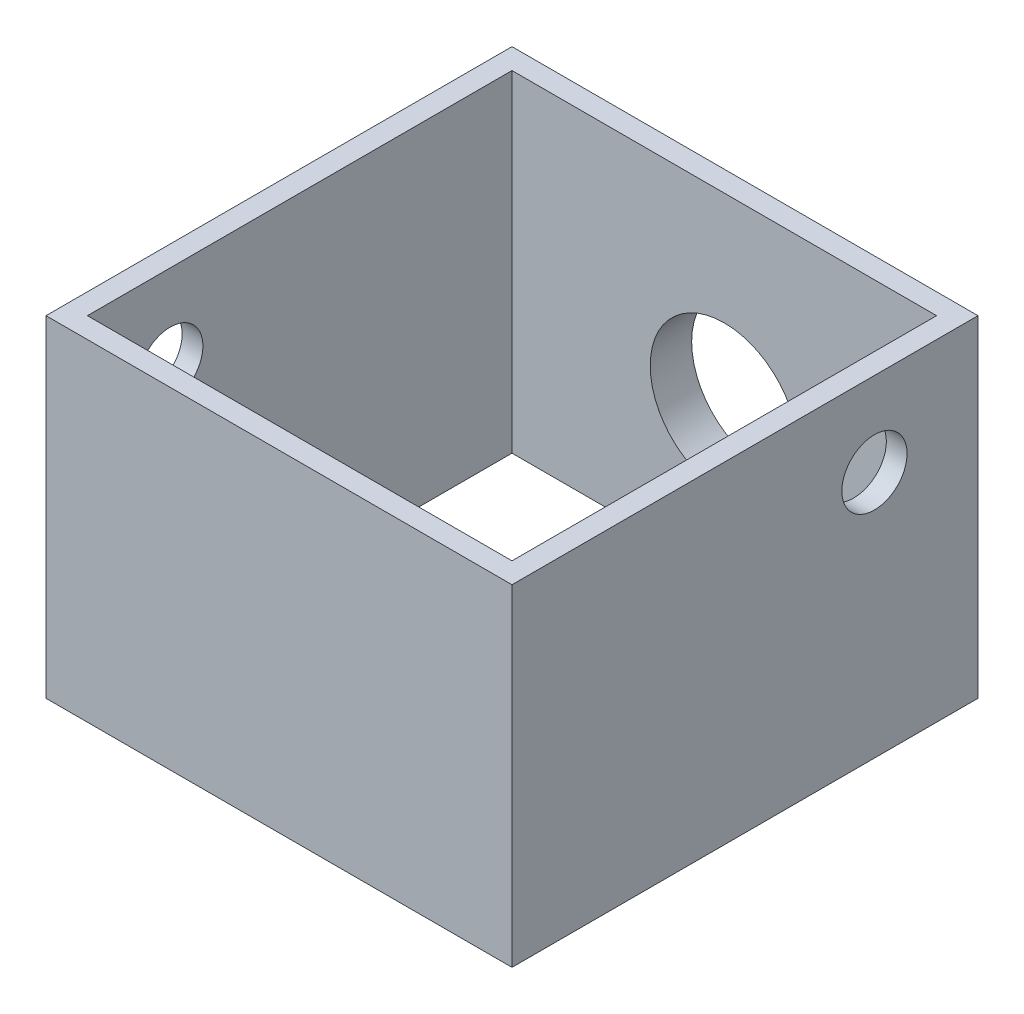
ISO-10303-21;
HEADER;
FILE_DESCRIPTION(('STEP AP214'),'2;1');
FILE_NAME('part.step','',(''),(''),'','','');
FILE_SCHEMA(('AUTOMOTIVE_DESIGN { 1 0 10303 214 1 1 1 1 }'));
ENDSEC;
DATA;
#1=APPLICATION_CONTEXT('core data for automotive mechanical design processes');
#2=APPLICATION_PROTOCOL_DEFINITION('international standard','automotive_design',2000,#1);
#3=PRODUCT_CONTEXT('',#1,'mechanical');
#4=PRODUCT('Part','Part','',(#3));
#5=PRODUCT_RELATED_PRODUCT_CATEGORY('part','',(#4));
#6=PRODUCT_DEFINITION_FORMATION('','',#4);
#7=PRODUCT_DEFINITION_CONTEXT('part definition',#1,'design');
#8=PRODUCT_DEFINITION('design','',#6,#7);
#9=PRODUCT_DEFINITION_SHAPE('','',#8);
#10=(LENGTH_UNIT() NAMED_UNIT(*) SI_UNIT(.MILLI.,.METRE.));
#11=(NAMED_UNIT(*) PLANE_ANGLE_UNIT() SI_UNIT($,.RADIAN.));
#12=(NAMED_UNIT(*) SI_UNIT($,.STERADIAN.) SOLID_ANGLE_UNIT());
#13=UNCERTAINTY_MEASURE_WITH_UNIT(LENGTH_MEASURE(1.E-05),#10,'distance_accuracy_value','');
#14=(GEOMETRIC_REPRESENTATION_CONTEXT(3) GLOBAL_UNCERTAINTY_ASSIGNED_CONTEXT((#13)) GLOBAL_UNIT_ASSIGNED_CONTEXT((#10,
#11,#12)) REPRESENTATION_CONTEXT('',''));
#15=CARTESIAN_POINT('',(0.,0.,0.));
#16=DIRECTION('',(0.,0.,1.));
#17=DIRECTION('',(1.,0.,0.));
#18=AXIS2_PLACEMENT_3D('',#15,#16,#17);
#19=CARTESIAN_POINT('',(0.,160.,-100.));
#20=DIRECTION('',(0.,0.,1.));
#21=DIRECTION('',(1.,0.,0.));
#22=AXIS2_PLACEMENT_3D('',#19,#20,#21);
#23=PLANE('',#22);
#24=DIRECTION('',(-1.,0.,0.));
#25=VECTOR('',#24,1.);
#26=CARTESIAN_POINT('',(0.,0.,-100.));
#27=LINE('',#26,#25);
#28=CARTESIAN_POINT('',(90.,0.,-100.));
#29=VERTEX_POINT('',#28);
#30=CARTESIAN_POINT('',(-135.,0.,-100.));
#31=VERTEX_POINT('',#30);
#32=EDGE_CURVE('E140',#29,#31,#27,.T.);
#33=ORIENTED_EDGE('',*,*,#32,.T.);
#34=DIRECTION('',(0.,-1.,0.));
#35=VECTOR('',#34,1.);
#36=CARTESIAN_POINT('',(-135.,160.,-100.));
#37=LINE('',#36,#35);
#38=CARTESIAN_POINT('',(-135.,160.,-100.));
#39=VERTEX_POINT('',#38);
#40=EDGE_CURVE('E130',#39,#31,#37,.T.);
#41=ORIENTED_EDGE('',*,*,#40,.F.);
#42=DIRECTION('',(-1.,0.,0.));
#43=VECTOR('',#42,1.);
#44=CARTESIAN_POINT('',(0.,160.,-100.));
#45=LINE('',#44,#43);
#46=CARTESIAN_POINT('',(90.,160.,-100.));
#47=VERTEX_POINT('',#46);
#48=EDGE_CURVE('E118',#47,#39,#45,.T.);
#49=ORIENTED_EDGE('',*,*,#48,.F.);
#50=DIRECTION('',(0.,-1.,0.));
#51=VECTOR('',#50,1.);
#52=CARTESIAN_POINT('',(90.,160.,-100.));
#53=LINE('',#52,#51);
#54=EDGE_CURVE('E65',#47,#29,#53,.T.);
#55=ORIENTED_EDGE('',*,*,#54,.T.);
#56=EDGE_LOOP('',(#33,#41,#49,#55));
#57=FACE_BOUND('',#56,.T.);
#58=CARTESIAN_POINT('',(-22.5,70.,-100.));
#59=DIRECTION('',(0.,0.,1.));
#60=DIRECTION('',(1.,0.,0.));
#61=AXIS2_PLACEMENT_3D('',#58,#59,#60);
#62=CIRCLE('',#61,50.);
#63=CARTESIAN_POINT('',(27.5000000000001,70.,-100.));
#64=VERTEX_POINT('',#63);
#65=EDGE_CURVE('E166',#64,#64,#62,.F.);
#66=ORIENTED_EDGE('',*,*,#65,.F.);
#67=EDGE_LOOP('',(#66));
#68=FACE_BOUND('',#67,.T.);
#69=ADVANCED_FACE('F41',(#57,#68),#23,.F.);
#70=CARTESIAN_POINT('',(-135.,160.,0.));
#71=DIRECTION('',(1.,0.,0.));
#72=DIRECTION('',(0.,0.,-1.));
#73=AXIS2_PLACEMENT_3D('',#70,#71,#72);
#74=PLANE('',#73);
#75=CARTESIAN_POINT('',(-135.,119.5,75.));
#76=DIRECTION('',(-1.,0.,0.));
#77=DIRECTION('',(0.,0.,1.));
#78=AXIS2_PLACEMENT_3D('',#75,#76,#77);
#79=CIRCLE('',#78,15.75);
#80=CARTESIAN_POINT('',(-135.,119.5,90.75));
#81=VERTEX_POINT('',#80);
#82=EDGE_CURVE('E263',#81,#81,#79,.T.);
#83=ORIENTED_EDGE('',*,*,#82,.F.);
#84=EDGE_LOOP('',(#83));
#85=FACE_BOUND('',#84,.T.);
#86=DIRECTION('',(0.,0.,1.));
#87=VECTOR('',#86,1.);
#88=CARTESIAN_POINT('',(-135.,0.,0.));
#89=LINE('',#88,#87);
#90=CARTESIAN_POINT('',(-135.,0.,125.));
#91=VERTEX_POINT('',#90);
#92=EDGE_CURVE('E126',#31,#91,#89,.T.);
#93=ORIENTED_EDGE('',*,*,#92,.T.);
#94=DIRECTION('',(0.,-1.,0.));
#95=VECTOR('',#94,1.);
#96=CARTESIAN_POINT('',(-135.,160.,125.));
#97=LINE('',#96,#95);
#98=CARTESIAN_POINT('',(-135.,160.,125.));
#99=VERTEX_POINT('',#98);
#100=EDGE_CURVE('E124',#99,#91,#97,.T.);
#101=ORIENTED_EDGE('',*,*,#100,.F.);
#102=DIRECTION('',(0.,0.,1.));
#103=VECTOR('',#102,1.);
#104=CARTESIAN_POINT('',(-135.,160.,0.));
#105=LINE('',#104,#103);
#106=EDGE_CURVE('E112',#39,#99,#105,.T.);
#107=ORIENTED_EDGE('',*,*,#106,.F.);
#108=ORIENTED_EDGE('',*,*,#40,.T.);
#109=EDGE_LOOP('',(#93,#101,#107,#108));
#110=FACE_BOUND('',#109,.T.);
#111=ADVANCED_FACE('F125',(#85,#110),#74,.F.);
#112=CARTESIAN_POINT('',(0.,160.,125.));
#113=DIRECTION('',(0.,0.,1.));
#114=DIRECTION('',(1.,0.,0.));
#115=AXIS2_PLACEMENT_3D('',#112,#113,#114);
#116=PLANE('',#115);
#117=DIRECTION('',(-1.,0.,0.));
#118=VECTOR('',#117,1.);
#119=CARTESIAN_POINT('',(0.,0.,125.));
#120=LINE('',#119,#118);
#121=CARTESIAN_POINT('',(90.,0.,125.));
#122=VERTEX_POINT('',#121);
#123=EDGE_CURVE('E144',#122,#91,#120,.T.);
#124=ORIENTED_EDGE('',*,*,#123,.F.);
#125=DIRECTION('',(0.,-1.,0.));
#126=VECTOR('',#125,1.);
#127=CARTESIAN_POINT('',(90.,160.,125.));
#128=LINE('',#127,#126);
#129=CARTESIAN_POINT('',(90.,160.,125.));
#130=VERTEX_POINT('',#129);
#131=EDGE_CURVE('E131',#130,#122,#128,.T.);
#132=ORIENTED_EDGE('',*,*,#131,.F.);
#133=DIRECTION('',(-1.,0.,0.));
#134=VECTOR('',#133,1.);
#135=CARTESIAN_POINT('',(0.,160.,125.));
#136=LINE('',#135,#134);
#137=EDGE_CURVE('E117',#130,#99,#136,.T.);
#138=ORIENTED_EDGE('',*,*,#137,.T.);
#139=ORIENTED_EDGE('',*,*,#100,.T.);
#140=EDGE_LOOP('',(#124,#132,#138,#139));
#141=FACE_BOUND('',#140,.T.);
#142=ADVANCED_FACE('F133',(#141),#116,.T.);
#143=CARTESIAN_POINT('',(-125.,160.,0.));
#144=DIRECTION('',(1.,0.,0.));
#145=DIRECTION('',(0.,0.,-1.));
#146=AXIS2_PLACEMENT_3D('',#143,#144,#145);
#147=PLANE('',#146);
#148=CARTESIAN_POINT('',(-125.,119.5,75.));
#149=DIRECTION('',(-1.,0.,0.));
#150=DIRECTION('',(0.,0.,1.));
#151=AXIS2_PLACEMENT_3D('',#148,#149,#150);
#152=CIRCLE('',#151,15.75);
#153=CARTESIAN_POINT('',(-125.,119.5,90.75));
#154=VERTEX_POINT('',#153);
#155=EDGE_CURVE('E266',#154,#154,#152,.T.);
#156=ORIENTED_EDGE('',*,*,#155,.T.);
#157=EDGE_LOOP('',(#156));
#158=FACE_BOUND('',#157,.T.);
#159=DIRECTION('',(0.,-1.,0.));
#160=VECTOR('',#159,1.);
#161=CARTESIAN_POINT('',(-125.,160.,115.));
#162=LINE('',#161,#160);
#163=CARTESIAN_POINT('',(-125.,160.,115.));
#164=VERTEX_POINT('',#163);
#165=CARTESIAN_POINT('',(-125.,0.,115.));
#166=VERTEX_POINT('',#165);
#167=EDGE_CURVE('E136',#164,#166,#162,.T.);
#168=ORIENTED_EDGE('',*,*,#167,.T.);
#169=DIRECTION('',(0.,0.,1.));
#170=VECTOR('',#169,1.);
#171=CARTESIAN_POINT('',(-125.,0.,0.));
#172=LINE('',#171,#170);
#173=CARTESIAN_POINT('',(-125.,0.,-90.));
#174=VERTEX_POINT('',#173);
#175=EDGE_CURVE('E11',#174,#166,#172,.T.);
#176=ORIENTED_EDGE('',*,*,#175,.F.);
#177=DIRECTION('',(0.,-1.,0.));
#178=VECTOR('',#177,1.);
#179=CARTESIAN_POINT('',(-125.,160.,-90.));
#180=LINE('',#179,#178);
#181=CARTESIAN_POINT('',(-125.,160.,-90.));
#182=VERTEX_POINT('',#181);
#183=EDGE_CURVE('E93',#182,#174,#180,.T.);
#184=ORIENTED_EDGE('',*,*,#183,.F.);
#185=DIRECTION('',(0.,0.,1.));
#186=VECTOR('',#185,1.);
#187=CARTESIAN_POINT('',(-125.,160.,0.));
#188=LINE('',#187,#186);
#189=EDGE_CURVE('E149',#182,#164,#188,.T.);
#190=ORIENTED_EDGE('',*,*,#189,.T.);
#191=EDGE_LOOP('',(#168,#176,#184,#190));
#192=FACE_BOUND('',#191,.T.);
#193=ADVANCED_FACE('F43',(#158,#192),#147,.T.);
#194=CARTESIAN_POINT('',(0.,160.,-90.));
#195=DIRECTION('',(0.,0.,1.));
#196=DIRECTION('',(1.,0.,0.));
#197=AXIS2_PLACEMENT_3D('',#194,#195,#196);
#198=PLANE('',#197);
#199=CARTESIAN_POINT('',(-22.5,70.,-90.));
#200=DIRECTION('',(0.,0.,1.));
#201=DIRECTION('',(1.,0.,0.));
#202=AXIS2_PLACEMENT_3D('',#199,#200,#201);
#203=CIRCLE('',#202,35.75);
#204=CARTESIAN_POINT('',(13.25,70.,-90.));
#205=VERTEX_POINT('',#204);
#206=EDGE_CURVE('E142',#205,#205,#203,.T.);
#207=ORIENTED_EDGE('',*,*,#206,.F.);
#208=EDGE_LOOP('',(#207));
#209=FACE_BOUND('',#208,.T.);
#210=ORIENTED_EDGE('',*,*,#183,.T.);
#211=DIRECTION('',(-1.,0.,0.));
#212=VECTOR('',#211,1.);
#213=CARTESIAN_POINT('',(0.,0.,-90.));
#214=LINE('',#213,#212);
#215=CARTESIAN_POINT('',(80.0000000000001,0.,-90.));
#216=VERTEX_POINT('',#215);
#217=EDGE_CURVE('E49',#216,#174,#214,.T.);
#218=ORIENTED_EDGE('',*,*,#217,.F.);
#219=DIRECTION('',(0.,-1.,0.));
#220=VECTOR('',#219,1.);
#221=CARTESIAN_POINT('',(80.,160.,-90.));
#222=LINE('',#221,#220);
#223=CARTESIAN_POINT('',(80.,160.,-90.));
#224=VERTEX_POINT('',#223);
#225=EDGE_CURVE('E157',#224,#216,#222,.T.);
#226=ORIENTED_EDGE('',*,*,#225,.F.);
#227=DIRECTION('',(-1.,0.,0.));
#228=VECTOR('',#227,1.);
#229=CARTESIAN_POINT('',(0.,160.,-90.));
#230=LINE('',#229,#228);
#231=EDGE_CURVE('E286',#224,#182,#230,.T.);
#232=ORIENTED_EDGE('',*,*,#231,.T.);
#233=EDGE_LOOP('',(#210,#218,#226,#232));
#234=FACE_BOUND('',#233,.T.);
#235=ADVANCED_FACE('F182',(#209,#234),#198,.T.);
#236=CARTESIAN_POINT('',(80.,160.,0.));
#237=DIRECTION('',(1.,0.,0.));
#238=DIRECTION('',(0.,0.,-1.));
#239=AXIS2_PLACEMENT_3D('',#236,#237,#238);
#240=PLANE('',#239);
#241=CARTESIAN_POINT('',(80.,119.5,-50.));
#242=DIRECTION('',(1.,0.,0.));
#243=DIRECTION('',(0.,0.,-1.));
#244=AXIS2_PLACEMENT_3D('',#241,#242,#243);
#245=CIRCLE('',#244,15.75);
#246=CARTESIAN_POINT('',(80.,119.5,-65.75));
#247=VERTEX_POINT('',#246);
#248=EDGE_CURVE('E258',#247,#247,#245,.T.);
#249=ORIENTED_EDGE('',*,*,#248,.T.);
#250=EDGE_LOOP('',(#249));
#251=FACE_BOUND('',#250,.T.);
#252=ORIENTED_EDGE('',*,*,#225,.T.);
#253=DIRECTION('',(0.,0.,-1.));
#254=VECTOR('',#253,1.);
#255=CARTESIAN_POINT('',(80.0000000000001,0.,0.));
#256=LINE('',#255,#254);
#257=CARTESIAN_POINT('',(80.0000000000001,0.,115.));
#258=VERTEX_POINT('',#257);
#259=EDGE_CURVE('E172',#258,#216,#256,.T.);
#260=ORIENTED_EDGE('',*,*,#259,.F.);
#261=DIRECTION('',(0.,-1.,0.));
#262=VECTOR('',#261,1.);
#263=CARTESIAN_POINT('',(80.0000000000001,160.,115.));
#264=LINE('',#263,#262);
#265=CARTESIAN_POINT('',(80.0000000000001,160.,115.));
#266=VERTEX_POINT('',#265);
#267=EDGE_CURVE('E56',#266,#258,#264,.T.);
#268=ORIENTED_EDGE('',*,*,#267,.F.);
#269=DIRECTION('',(0.,0.,1.));
#270=VECTOR('',#269,1.);
#271=CARTESIAN_POINT('',(80.,160.,0.));
#272=LINE('',#271,#270);
#273=EDGE_CURVE('E288',#224,#266,#272,.T.);
#274=ORIENTED_EDGE('',*,*,#273,.F.);
#275=EDGE_LOOP('',(#252,#260,#268,#274));
#276=FACE_BOUND('',#275,.T.);
#277=ADVANCED_FACE('F191',(#251,#276),#240,.F.);
#278=CARTESIAN_POINT('',(0.,160.,115.));
#279=DIRECTION('',(0.,0.,1.));
#280=DIRECTION('',(1.,0.,0.));
#281=AXIS2_PLACEMENT_3D('',#278,#279,#280);
#282=PLANE('',#281);
#283=CARTESIAN_POINT('',(-22.5,70.,115.));
#284=DIRECTION('',(0.,0.,1.));
#285=DIRECTION('',(1.,0.,0.));
#286=AXIS2_PLACEMENT_3D('',#283,#284,#285);
#287=CIRCLE('',#286,50.);
#288=CARTESIAN_POINT('',(27.5000000000001,70.,115.));
#289=VERTEX_POINT('',#288);
#290=EDGE_CURVE('E153',#289,#289,#287,.F.);
#291=ORIENTED_EDGE('',*,*,#290,.F.);
#292=EDGE_LOOP('',(#291));
#293=FACE_BOUND('',#292,.T.);
#294=ORIENTED_EDGE('',*,*,#267,.T.);
#295=DIRECTION('',(1.,0.,0.));
#296=VECTOR('',#295,1.);
#297=CARTESIAN_POINT('',(0.,0.,115.));
#298=LINE('',#297,#296);
#299=EDGE_CURVE('E169',#166,#258,#298,.T.);
#300=ORIENTED_EDGE('',*,*,#299,.F.);
#301=ORIENTED_EDGE('',*,*,#167,.F.);
#302=DIRECTION('',(-1.,0.,0.));
#303=VECTOR('',#302,1.);
#304=CARTESIAN_POINT('',(0.,160.,115.));
#305=LINE('',#304,#303);
#306=EDGE_CURVE('E290',#266,#164,#305,.T.);
#307=ORIENTED_EDGE('',*,*,#306,.F.);
#308=EDGE_LOOP('',(#294,#300,#301,#307));
#309=FACE_BOUND('',#308,.T.);
#310=ADVANCED_FACE('F188',(#293,#309),#282,.F.);
#311=CARTESIAN_POINT('',(90.,160.,0.));
#312=DIRECTION('',(1.,0.,0.));
#313=DIRECTION('',(0.,0.,-1.));
#314=AXIS2_PLACEMENT_3D('',#311,#312,#313);
#315=PLANE('',#314);
#316=CARTESIAN_POINT('',(90.,119.5,-50.));
#317=DIRECTION('',(1.,0.,0.));
#318=DIRECTION('',(0.,0.,-1.));
#319=AXIS2_PLACEMENT_3D('',#316,#317,#318);
#320=CIRCLE('',#319,15.75);
#321=CARTESIAN_POINT('',(90.,119.5,-65.75));
#322=VERTEX_POINT('',#321);
#323=EDGE_CURVE('E261',#322,#322,#320,.T.);
#324=ORIENTED_EDGE('',*,*,#323,.F.);
#325=EDGE_LOOP('',(#324));
#326=FACE_BOUND('',#325,.T.);
#327=DIRECTION('',(0.,0.,1.));
#328=VECTOR('',#327,1.);
#329=CARTESIAN_POINT('',(90.,0.,0.));
#330=LINE('',#329,#328);
#331=EDGE_CURVE('E146',#29,#122,#330,.T.);
#332=ORIENTED_EDGE('',*,*,#331,.F.);
#333=ORIENTED_EDGE('',*,*,#54,.F.);
#334=DIRECTION('',(0.,0.,1.));
#335=VECTOR('',#334,1.);
#336=CARTESIAN_POINT('',(90.,160.,0.));
#337=LINE('',#336,#335);
#338=EDGE_CURVE('E134',#47,#130,#337,.T.);
#339=ORIENTED_EDGE('',*,*,#338,.T.);
#340=ORIENTED_EDGE('',*,*,#131,.T.);
#341=EDGE_LOOP('',(#332,#333,#339,#340));
#342=FACE_BOUND('',#341,.T.);
#343=ADVANCED_FACE('F190',(#326,#342),#315,.T.);
#344=CARTESIAN_POINT('',(0.,160.,0.));
#345=DIRECTION('',(0.,1.,0.));
#346=DIRECTION('',(0.,0.,1.));
#347=AXIS2_PLACEMENT_3D('',#344,#345,#346);
#348=PLANE('',#347);
#349=ORIENTED_EDGE('',*,*,#189,.F.);
#350=ORIENTED_EDGE('',*,*,#231,.F.);
#351=ORIENTED_EDGE('',*,*,#273,.T.);
#352=ORIENTED_EDGE('',*,*,#306,.T.);
#353=EDGE_LOOP('',(#349,#350,#351,#352));
#354=FACE_BOUND('',#353,.T.);
#355=ORIENTED_EDGE('',*,*,#48,.T.);
#356=ORIENTED_EDGE('',*,*,#106,.T.);
#357=ORIENTED_EDGE('',*,*,#137,.F.);
#358=ORIENTED_EDGE('',*,*,#338,.F.);
#359=EDGE_LOOP('',(#355,#356,#357,#358));
#360=FACE_BOUND('',#359,.T.);
#361=ADVANCED_FACE('F114',(#354,#360),#348,.T.);
#362=CARTESIAN_POINT('',(0.,0.,0.));
#363=DIRECTION('',(0.,1.,0.));
#364=DIRECTION('',(0.,0.,1.));
#365=AXIS2_PLACEMENT_3D('',#362,#363,#364);
#366=PLANE('',#365);
#367=ORIENTED_EDGE('',*,*,#217,.T.);
#368=ORIENTED_EDGE('',*,*,#175,.T.);
#369=ORIENTED_EDGE('',*,*,#299,.T.);
#370=ORIENTED_EDGE('',*,*,#259,.T.);
#371=EDGE_LOOP('',(#367,#368,#369,#370));
#372=FACE_BOUND('',#371,.T.);
#373=ORIENTED_EDGE('',*,*,#32,.F.);
#374=ORIENTED_EDGE('',*,*,#331,.T.);
#375=ORIENTED_EDGE('',*,*,#123,.T.);
#376=ORIENTED_EDGE('',*,*,#92,.F.);
#377=EDGE_LOOP('',(#373,#374,#375,#376));
#378=FACE_BOUND('',#377,.T.);
#379=ADVANCED_FACE('F177',(#372,#378),#366,.F.);
#380=CARTESIAN_POINT('',(-22.5,70.,97.));
#381=DIRECTION('',(0.,0.,-1.));
#382=DIRECTION('',(-1.,0.,0.));
#383=AXIS2_PLACEMENT_3D('',#380,#381,#382);
#384=CYLINDRICAL_SURFACE('',#383,35.75);
#385=ORIENTED_EDGE('',*,*,#206,.T.);
#386=EDGE_LOOP('',(#385));
#387=FACE_BOUND('',#386,.T.);
#388=CARTESIAN_POINT('',(-22.5,70.,-110.));
#389=DIRECTION('',(0.,0.,-1.));
#390=DIRECTION('',(-1.,0.,0.));
#391=AXIS2_PLACEMENT_3D('',#388,#389,#390);
#392=CIRCLE('',#391,35.75);
#393=CARTESIAN_POINT('',(-58.25,70.,-110.));
#394=VERTEX_POINT('',#393);
#395=EDGE_CURVE('E269',#394,#394,#392,.T.);
#396=ORIENTED_EDGE('',*,*,#395,.T.);
#397=EDGE_LOOP('',(#396));
#398=FACE_BOUND('',#397,.T.);
#399=ADVANCED_FACE('F221',(#387,#398),#384,.F.);
#400=CARTESIAN_POINT('',(-22.5,70.,101.));
#401=DIRECTION('',(0.,0.,-1.));
#402=DIRECTION('',(-1.,0.,0.));
#403=AXIS2_PLACEMENT_3D('',#400,#401,#402);
#404=PLANE('',#403);
#405=CARTESIAN_POINT('',(-22.5,70.,101.));
#406=DIRECTION('',(0.,0.,-1.));
#407=DIRECTION('',(-1.,0.,0.));
#408=AXIS2_PLACEMENT_3D('',#405,#406,#407);
#409=CIRCLE('',#408,50.);
#410=CARTESIAN_POINT('',(-72.5,70.,101.));
#411=VERTEX_POINT('',#410);
#412=EDGE_CURVE('E163',#411,#411,#409,.T.);
#413=ORIENTED_EDGE('',*,*,#412,.T.);
#414=EDGE_LOOP('',(#413));
#415=FACE_BOUND('',#414,.T.);
#416=CARTESIAN_POINT('',(-22.5,70.,101.));
#417=DIRECTION('',(0.,0.,-1.));
#418=DIRECTION('',(-1.,0.,0.));
#419=AXIS2_PLACEMENT_3D('',#416,#417,#418);
#420=CIRCLE('',#419,35.75);
#421=CARTESIAN_POINT('',(-58.25,70.,101.));
#422=VERTEX_POINT('',#421);
#423=EDGE_CURVE('E278',#422,#422,#420,.T.);
#424=ORIENTED_EDGE('',*,*,#423,.F.);
#425=EDGE_LOOP('',(#424));
#426=FACE_BOUND('',#425,.T.);
#427=ADVANCED_FACE('F227',(#415,#426),#404,.T.);
#428=CARTESIAN_POINT('',(-22.5,70.,101.));
#429=DIRECTION('',(0.,0.,1.));
#430=DIRECTION('',(1.,0.,0.));
#431=AXIS2_PLACEMENT_3D('',#428,#429,#430);
#432=CYLINDRICAL_SURFACE('',#431,50.);
#433=ORIENTED_EDGE('',*,*,#412,.F.);
#434=EDGE_LOOP('',(#433));
#435=FACE_BOUND('',#434,.T.);
#436=ORIENTED_EDGE('',*,*,#290,.T.);
#437=EDGE_LOOP('',(#436));
#438=FACE_BOUND('',#437,.T.);
#439=ADVANCED_FACE('F229',(#435,#438),#432,.T.);
#440=CARTESIAN_POINT('',(-22.5,70.,101.));
#441=DIRECTION('',(0.,0.,1.));
#442=DIRECTION('',(1.,0.,0.));
#443=AXIS2_PLACEMENT_3D('',#440,#441,#442);
#444=CYLINDRICAL_SURFACE('',#443,35.75);
#445=ORIENTED_EDGE('',*,*,#423,.T.);
#446=EDGE_LOOP('',(#445));
#447=FACE_BOUND('',#446,.T.);
#448=CARTESIAN_POINT('',(-22.5,70.,115.));
#449=DIRECTION('',(0.,0.,-1.));
#450=DIRECTION('',(-1.,0.,0.));
#451=AXIS2_PLACEMENT_3D('',#448,#449,#450);
#452=CIRCLE('',#451,35.75);
#453=CARTESIAN_POINT('',(-58.25,70.,115.));
#454=VERTEX_POINT('',#453);
#455=EDGE_CURVE('E277',#454,#454,#452,.T.);
#456=ORIENTED_EDGE('',*,*,#455,.F.);
#457=EDGE_LOOP('',(#456));
#458=FACE_BOUND('',#457,.T.);
#459=ADVANCED_FACE('F207',(#447,#458),#444,.F.);
#460=ORIENTED_EDGE('',*,*,#455,.T.);
#461=EDGE_LOOP('',(#460));
#462=FACE_BOUND('',#461,.T.);
#463=ADVANCED_FACE('F194',(#462),#282,.F.);
#464=CARTESIAN_POINT('',(-22.5,70.,-110.));
#465=DIRECTION('',(0.,0.,-1.));
#466=DIRECTION('',(-1.,0.,0.));
#467=AXIS2_PLACEMENT_3D('',#464,#465,#466);
#468=PLANE('',#467);
#469=CARTESIAN_POINT('',(-22.5,70.,-110.));
#470=DIRECTION('',(0.,0.,-1.));
#471=DIRECTION('',(-1.,0.,0.));
#472=AXIS2_PLACEMENT_3D('',#469,#470,#471);
#473=CIRCLE('',#472,50.);
#474=CARTESIAN_POINT('',(-72.5000000000001,70.,-110.));
#475=VERTEX_POINT('',#474);
#476=EDGE_CURVE('E274',#475,#475,#473,.T.);
#477=ORIENTED_EDGE('',*,*,#476,.T.);
#478=EDGE_LOOP('',(#477));
#479=FACE_BOUND('',#478,.T.);
#480=ORIENTED_EDGE('',*,*,#395,.F.);
#481=EDGE_LOOP('',(#480));
#482=FACE_BOUND('',#481,.T.);
#483=ADVANCED_FACE('F206',(#479,#482),#468,.T.);
#484=CARTESIAN_POINT('',(-22.5,70.,-110.));
#485=DIRECTION('',(0.,0.,1.));
#486=DIRECTION('',(1.,0.,0.));
#487=AXIS2_PLACEMENT_3D('',#484,#485,#486);
#488=CYLINDRICAL_SURFACE('',#487,50.);
#489=ORIENTED_EDGE('',*,*,#476,.F.);
#490=EDGE_LOOP('',(#489));
#491=FACE_BOUND('',#490,.T.);
#492=ORIENTED_EDGE('',*,*,#65,.T.);
#493=EDGE_LOOP('',(#492));
#494=FACE_BOUND('',#493,.T.);
#495=ADVANCED_FACE('F239',(#491,#494),#488,.T.);
#496=CARTESIAN_POINT('',(-125.,119.5,75.));
#497=DIRECTION('',(-1.,0.,0.));
#498=DIRECTION('',(0.,0.,1.));
#499=AXIS2_PLACEMENT_3D('',#496,#497,#498);
#500=CYLINDRICAL_SURFACE('',#499,15.75);
#501=ORIENTED_EDGE('',*,*,#155,.F.);
#502=EDGE_LOOP('',(#501));
#503=FACE_BOUND('',#502,.T.);
#504=ORIENTED_EDGE('',*,*,#82,.T.);
#505=EDGE_LOOP('',(#504));
#506=FACE_BOUND('',#505,.T.);
#507=ADVANCED_FACE('F242',(#503,#506),#500,.F.);
#508=CARTESIAN_POINT('',(80.,119.5,-50.));
#509=DIRECTION('',(1.,0.,0.));
#510=DIRECTION('',(0.,0.,-1.));
#511=AXIS2_PLACEMENT_3D('',#508,#509,#510);
#512=CYLINDRICAL_SURFACE('',#511,15.75);
#513=ORIENTED_EDGE('',*,*,#248,.F.);
#514=EDGE_LOOP('',(#513));
#515=FACE_BOUND('',#514,.T.);
#516=ORIENTED_EDGE('',*,*,#323,.T.);
#517=EDGE_LOOP('',(#516));
#518=FACE_BOUND('',#517,.T.);
#519=ADVANCED_FACE('F249',(#515,#518),#512,.F.);
#520=CLOSED_SHELL('',(#69,#111,#142,#193,#235,#277,#310,#343,#361,#379,#399,#427,#439,#459,#463,
#483,#495,#507,#519));
#521=MANIFOLD_SOLID_BREP('B2',#520);
#522=ADVANCED_BREP_SHAPE_REPRESENTATION('',(#18,#521),#14);
#523=SHAPE_DEFINITION_REPRESENTATION(#9,#522);
ENDSEC;
END-ISO-10303-21;
